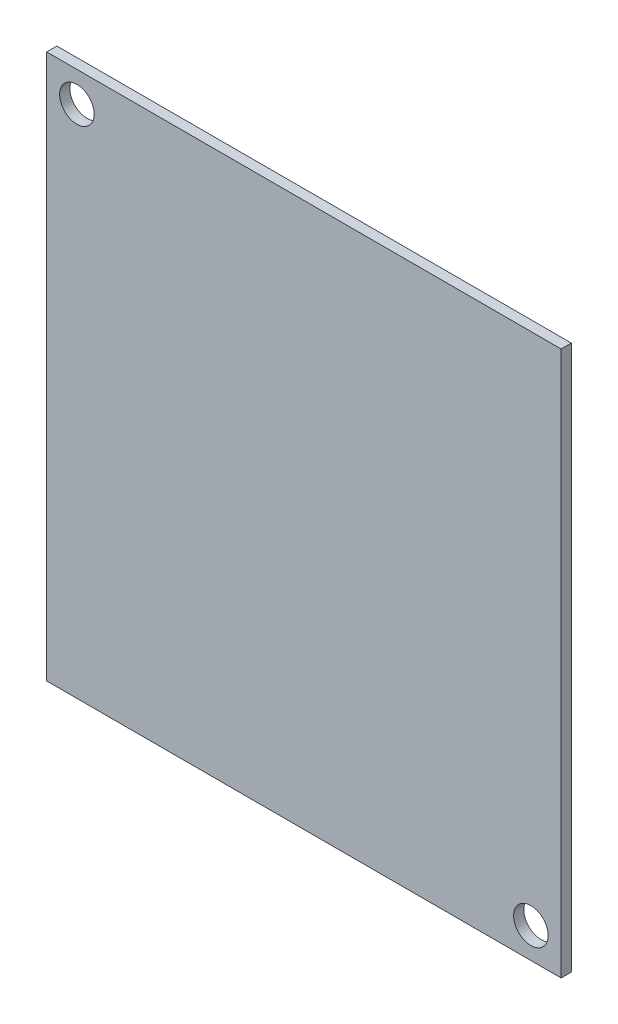
ISO-10303-21;
HEADER;
FILE_DESCRIPTION(('STEP AP214'),'2;1');
FILE_NAME('part.step','',(''),(''),'','','');
FILE_SCHEMA(('AUTOMOTIVE_DESIGN { 1 0 10303 214 1 1 1 1 }'));
ENDSEC;
DATA;
#1=APPLICATION_CONTEXT('core data for automotive mechanical design processes');
#2=APPLICATION_PROTOCOL_DEFINITION('international standard','automotive_design',2000,#1);
#3=PRODUCT_CONTEXT('',#1,'mechanical');
#4=PRODUCT('Part','Part','',(#3));
#5=PRODUCT_RELATED_PRODUCT_CATEGORY('part','',(#4));
#6=PRODUCT_DEFINITION_FORMATION('','',#4);
#7=PRODUCT_DEFINITION_CONTEXT('part definition',#1,'design');
#8=PRODUCT_DEFINITION('design','',#6,#7);
#9=PRODUCT_DEFINITION_SHAPE('','',#8);
#10=(LENGTH_UNIT() NAMED_UNIT(*) SI_UNIT(.MILLI.,.METRE.));
#11=(NAMED_UNIT(*) PLANE_ANGLE_UNIT() SI_UNIT($,.RADIAN.));
#12=(NAMED_UNIT(*) SI_UNIT($,.STERADIAN.) SOLID_ANGLE_UNIT());
#13=UNCERTAINTY_MEASURE_WITH_UNIT(LENGTH_MEASURE(1.E-05),#10,'distance_accuracy_value','');
#14=(GEOMETRIC_REPRESENTATION_CONTEXT(3) GLOBAL_UNCERTAINTY_ASSIGNED_CONTEXT((#13)) GLOBAL_UNIT_ASSIGNED_CONTEXT((#10,
#11,#12)) REPRESENTATION_CONTEXT('',''));
#15=CARTESIAN_POINT('',(0.,0.,0.));
#16=DIRECTION('',(0.,0.,1.));
#17=DIRECTION('',(1.,0.,0.));
#18=AXIS2_PLACEMENT_3D('',#15,#16,#17);
#19=CARTESIAN_POINT('',(0.,80.01,1.5));
#20=DIRECTION('',(0.,0.,-1.));
#21=DIRECTION('',(-1.,0.,0.));
#22=AXIS2_PLACEMENT_3D('',#19,#20,#21);
#23=PLANE('',#22);
#24=CARTESIAN_POINT('',(4.445,75.565,1.5));
#25=DIRECTION('',(0.,0.,1.));
#26=DIRECTION('',(1.,0.,0.));
#27=AXIS2_PLACEMENT_3D('',#24,#25,#26);
#28=CIRCLE('',#27,2.53999999999999);
#29=CARTESIAN_POINT('',(6.98499999999999,75.565,1.5));
#30=VERTEX_POINT('',#29);
#31=EDGE_CURVE('E99',#30,#30,#28,.T.);
#32=ORIENTED_EDGE('',*,*,#31,.F.);
#33=EDGE_LOOP('',(#32));
#34=FACE_BOUND('',#33,.T.);
#35=DIRECTION('',(0.,-1.,0.));
#36=VECTOR('',#35,1.);
#37=CARTESIAN_POINT('',(0.,0.,1.5));
#38=LINE('',#37,#36);
#39=CARTESIAN_POINT('',(0.,80.01,1.5));
#40=VERTEX_POINT('',#39);
#41=CARTESIAN_POINT('',(0.,0.,1.5));
#42=VERTEX_POINT('',#41);
#43=EDGE_CURVE('E84',#40,#42,#38,.T.);
#44=ORIENTED_EDGE('',*,*,#43,.T.);
#45=DIRECTION('',(1.,0.,0.));
#46=VECTOR('',#45,1.);
#47=CARTESIAN_POINT('',(0.,0.,1.5));
#48=LINE('',#47,#46);
#49=CARTESIAN_POINT('',(75.565,0.,1.5));
#50=VERTEX_POINT('',#49);
#51=EDGE_CURVE('E79',#42,#50,#48,.T.);
#52=ORIENTED_EDGE('',*,*,#51,.T.);
#53=DIRECTION('',(0.,1.,0.));
#54=VECTOR('',#53,1.);
#55=CARTESIAN_POINT('',(75.565,0.,1.5));
#56=LINE('',#55,#54);
#57=CARTESIAN_POINT('',(75.565,80.01,1.5));
#58=VERTEX_POINT('',#57);
#59=EDGE_CURVE('E82',#50,#58,#56,.T.);
#60=ORIENTED_EDGE('',*,*,#59,.T.);
#61=DIRECTION('',(-1.,0.,0.));
#62=VECTOR('',#61,1.);
#63=CARTESIAN_POINT('',(0.,80.01,1.5));
#64=LINE('',#63,#62);
#65=EDGE_CURVE('E49',#58,#40,#64,.T.);
#66=ORIENTED_EDGE('',*,*,#65,.T.);
#67=EDGE_LOOP('',(#44,#52,#60,#66));
#68=FACE_BOUND('',#67,.T.);
#69=CARTESIAN_POINT('',(71.12,4.445,1.5));
#70=DIRECTION('',(0.,0.,1.));
#71=DIRECTION('',(1.,0.,0.));
#72=AXIS2_PLACEMENT_3D('',#69,#70,#71);
#73=CIRCLE('',#72,2.54);
#74=CARTESIAN_POINT('',(73.66,4.445,1.5));
#75=VERTEX_POINT('',#74);
#76=EDGE_CURVE('E114',#75,#75,#73,.T.);
#77=ORIENTED_EDGE('',*,*,#76,.F.);
#78=EDGE_LOOP('',(#77));
#79=FACE_BOUND('',#78,.T.);
#80=ADVANCED_FACE('F32',(#34,#68,#79),#23,.F.);
#81=CARTESIAN_POINT('',(0.,80.01,0.));
#82=DIRECTION('',(0.,0.,-1.));
#83=DIRECTION('',(-1.,0.,0.));
#84=AXIS2_PLACEMENT_3D('',#81,#82,#83);
#85=PLANE('',#84);
#86=CARTESIAN_POINT('',(4.445,75.565,0.));
#87=DIRECTION('',(0.,0.,1.));
#88=DIRECTION('',(1.,0.,0.));
#89=AXIS2_PLACEMENT_3D('',#86,#87,#88);
#90=CIRCLE('',#89,2.53999999999999);
#91=CARTESIAN_POINT('',(6.98499999999999,75.565,0.));
#92=VERTEX_POINT('',#91);
#93=EDGE_CURVE('E111',#92,#92,#90,.T.);
#94=ORIENTED_EDGE('',*,*,#93,.T.);
#95=EDGE_LOOP('',(#94));
#96=FACE_BOUND('',#95,.T.);
#97=DIRECTION('',(0.,-1.,0.));
#98=VECTOR('',#97,1.);
#99=CARTESIAN_POINT('',(0.,0.,0.));
#100=LINE('',#99,#98);
#101=CARTESIAN_POINT('',(0.,80.01,0.));
#102=VERTEX_POINT('',#101);
#103=CARTESIAN_POINT('',(0.,0.,0.));
#104=VERTEX_POINT('',#103);
#105=EDGE_CURVE('E96',#102,#104,#100,.T.);
#106=ORIENTED_EDGE('',*,*,#105,.F.);
#107=DIRECTION('',(-1.,0.,0.));
#108=VECTOR('',#107,1.);
#109=CARTESIAN_POINT('',(0.,80.01,0.));
#110=LINE('',#109,#108);
#111=CARTESIAN_POINT('',(75.565,80.01,0.));
#112=VERTEX_POINT('',#111);
#113=EDGE_CURVE('E72',#112,#102,#110,.T.);
#114=ORIENTED_EDGE('',*,*,#113,.F.);
#115=DIRECTION('',(0.,1.,0.));
#116=VECTOR('',#115,1.);
#117=CARTESIAN_POINT('',(75.565,0.,0.));
#118=LINE('',#117,#116);
#119=CARTESIAN_POINT('',(75.565,0.,0.));
#120=VERTEX_POINT('',#119);
#121=EDGE_CURVE('E66',#120,#112,#118,.T.);
#122=ORIENTED_EDGE('',*,*,#121,.F.);
#123=DIRECTION('',(1.,0.,0.));
#124=VECTOR('',#123,1.);
#125=CARTESIAN_POINT('',(0.,0.,0.));
#126=LINE('',#125,#124);
#127=EDGE_CURVE('E88',#104,#120,#126,.T.);
#128=ORIENTED_EDGE('',*,*,#127,.F.);
#129=EDGE_LOOP('',(#106,#114,#122,#128));
#130=FACE_BOUND('',#129,.T.);
#131=CARTESIAN_POINT('',(71.12,4.445,0.));
#132=DIRECTION('',(0.,0.,1.));
#133=DIRECTION('',(1.,0.,0.));
#134=AXIS2_PLACEMENT_3D('',#131,#132,#133);
#135=CIRCLE('',#134,2.54);
#136=CARTESIAN_POINT('',(73.66,4.445,0.));
#137=VERTEX_POINT('',#136);
#138=EDGE_CURVE('E117',#137,#137,#135,.T.);
#139=ORIENTED_EDGE('',*,*,#138,.T.);
#140=EDGE_LOOP('',(#139));
#141=FACE_BOUND('',#140,.T.);
#142=ADVANCED_FACE('F107',(#96,#130,#141),#85,.T.);
#143=CARTESIAN_POINT('',(0.,0.,1.5));
#144=DIRECTION('',(1.,0.,0.));
#145=DIRECTION('',(0.,0.,-1.));
#146=AXIS2_PLACEMENT_3D('',#143,#144,#145);
#147=PLANE('',#146);
#148=ORIENTED_EDGE('',*,*,#105,.T.);
#149=DIRECTION('',(0.,0.,-1.));
#150=VECTOR('',#149,1.);
#151=CARTESIAN_POINT('',(0.,0.,1.5));
#152=LINE('',#151,#150);
#153=EDGE_CURVE('E11',#42,#104,#152,.T.);
#154=ORIENTED_EDGE('',*,*,#153,.F.);
#155=ORIENTED_EDGE('',*,*,#43,.F.);
#156=DIRECTION('',(0.,0.,-1.));
#157=VECTOR('',#156,1.);
#158=CARTESIAN_POINT('',(0.,80.01,1.5));
#159=LINE('',#158,#157);
#160=EDGE_CURVE('E92',#40,#102,#159,.T.);
#161=ORIENTED_EDGE('',*,*,#160,.T.);
#162=EDGE_LOOP('',(#148,#154,#155,#161));
#163=FACE_BOUND('',#162,.T.);
#164=ADVANCED_FACE('F34',(#163),#147,.F.);
#165=CARTESIAN_POINT('',(0.,0.,1.5));
#166=DIRECTION('',(0.,1.,0.));
#167=DIRECTION('',(0.,0.,1.));
#168=AXIS2_PLACEMENT_3D('',#165,#166,#167);
#169=PLANE('',#168);
#170=ORIENTED_EDGE('',*,*,#127,.T.);
#171=DIRECTION('',(0.,0.,-1.));
#172=VECTOR('',#171,1.);
#173=CARTESIAN_POINT('',(75.565,0.,1.5));
#174=LINE('',#173,#172);
#175=EDGE_CURVE('E41',#50,#120,#174,.T.);
#176=ORIENTED_EDGE('',*,*,#175,.F.);
#177=ORIENTED_EDGE('',*,*,#51,.F.);
#178=ORIENTED_EDGE('',*,*,#153,.T.);
#179=EDGE_LOOP('',(#170,#176,#177,#178));
#180=FACE_BOUND('',#179,.T.);
#181=ADVANCED_FACE('F87',(#180),#169,.F.);
#182=CARTESIAN_POINT('',(75.565,0.,1.5));
#183=DIRECTION('',(-1.,0.,0.));
#184=DIRECTION('',(0.,0.,1.));
#185=AXIS2_PLACEMENT_3D('',#182,#183,#184);
#186=PLANE('',#185);
#187=ORIENTED_EDGE('',*,*,#121,.T.);
#188=DIRECTION('',(0.,0.,-1.));
#189=VECTOR('',#188,1.);
#190=CARTESIAN_POINT('',(75.565,80.01,1.5));
#191=LINE('',#190,#189);
#192=EDGE_CURVE('E89',#58,#112,#191,.T.);
#193=ORIENTED_EDGE('',*,*,#192,.F.);
#194=ORIENTED_EDGE('',*,*,#59,.F.);
#195=ORIENTED_EDGE('',*,*,#175,.T.);
#196=EDGE_LOOP('',(#187,#193,#194,#195));
#197=FACE_BOUND('',#196,.T.);
#198=ADVANCED_FACE('F90',(#197),#186,.F.);
#199=CARTESIAN_POINT('',(0.,80.01,1.5));
#200=DIRECTION('',(0.,-1.,0.));
#201=DIRECTION('',(0.,0.,-1.));
#202=AXIS2_PLACEMENT_3D('',#199,#200,#201);
#203=PLANE('',#202);
#204=ORIENTED_EDGE('',*,*,#113,.T.);
#205=ORIENTED_EDGE('',*,*,#160,.F.);
#206=ORIENTED_EDGE('',*,*,#65,.F.);
#207=ORIENTED_EDGE('',*,*,#192,.T.);
#208=EDGE_LOOP('',(#204,#205,#206,#207));
#209=FACE_BOUND('',#208,.T.);
#210=ADVANCED_FACE('F104',(#209),#203,.F.);
#211=CARTESIAN_POINT('',(4.445,75.565,1.5));
#212=DIRECTION('',(0.,0.,-1.));
#213=DIRECTION('',(-1.,0.,0.));
#214=AXIS2_PLACEMENT_3D('',#211,#212,#213);
#215=CYLINDRICAL_SURFACE('',#214,2.53999999999999);
#216=ORIENTED_EDGE('',*,*,#31,.T.);
#217=EDGE_LOOP('',(#216));
#218=FACE_BOUND('',#217,.T.);
#219=ORIENTED_EDGE('',*,*,#93,.F.);
#220=EDGE_LOOP('',(#219));
#221=FACE_BOUND('',#220,.T.);
#222=ADVANCED_FACE('F135',(#218,#221),#215,.F.);
#223=CARTESIAN_POINT('',(71.12,4.445,1.5));
#224=DIRECTION('',(0.,0.,-1.));
#225=DIRECTION('',(-1.,0.,0.));
#226=AXIS2_PLACEMENT_3D('',#223,#224,#225);
#227=CYLINDRICAL_SURFACE('',#226,2.54);
#228=ORIENTED_EDGE('',*,*,#76,.T.);
#229=EDGE_LOOP('',(#228));
#230=FACE_BOUND('',#229,.T.);
#231=ORIENTED_EDGE('',*,*,#138,.F.);
#232=EDGE_LOOP('',(#231));
#233=FACE_BOUND('',#232,.T.);
#234=ADVANCED_FACE('F123',(#230,#233),#227,.F.);
#235=CLOSED_SHELL('',(#80,#142,#164,#181,#198,#210,#222,#234));
#236=MANIFOLD_SOLID_BREP('B2',#235);
#237=ADVANCED_BREP_SHAPE_REPRESENTATION('',(#18,#236),#14);
#238=SHAPE_DEFINITION_REPRESENTATION(#9,#237);
ENDSEC;
END-ISO-10303-21;
